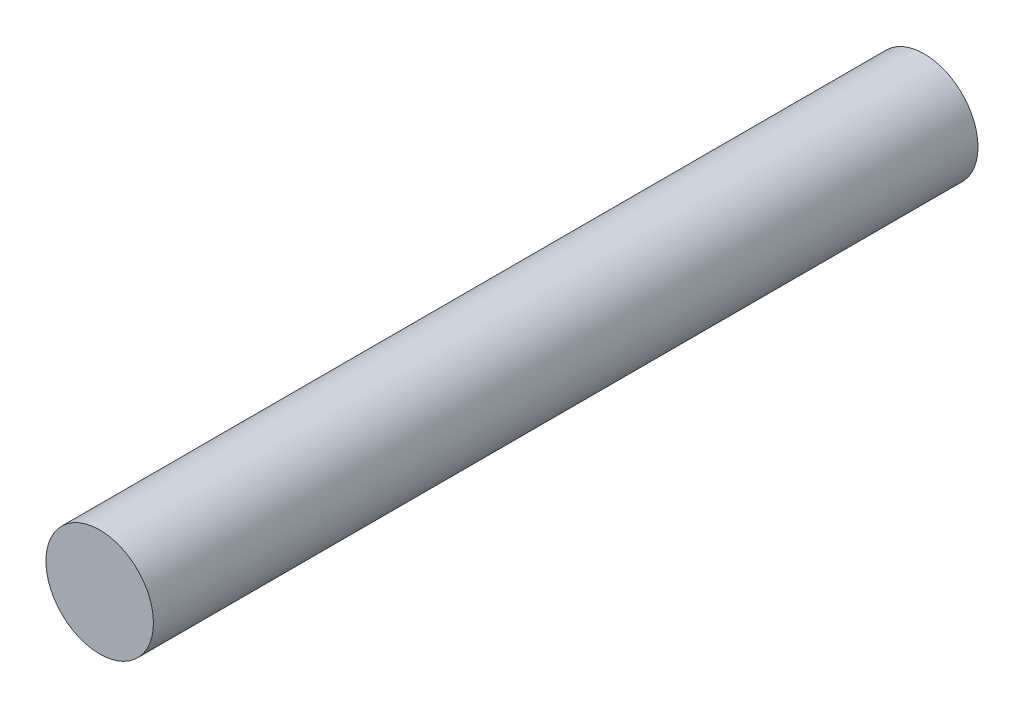
ISO-10303-21;
HEADER;
FILE_DESCRIPTION(('STEP AP214'),'2;1');
FILE_NAME('part.step','',(''),(''),'','','');
FILE_SCHEMA(('AUTOMOTIVE_DESIGN { 1 0 10303 214 1 1 1 1 }'));
ENDSEC;
DATA;
#1=APPLICATION_CONTEXT('core data for automotive mechanical design processes');
#2=APPLICATION_PROTOCOL_DEFINITION('international standard','automotive_design',2000,#1);
#3=PRODUCT_CONTEXT('',#1,'mechanical');
#4=PRODUCT('Part','Part','',(#3));
#5=PRODUCT_RELATED_PRODUCT_CATEGORY('part','',(#4));
#6=PRODUCT_DEFINITION_FORMATION('','',#4);
#7=PRODUCT_DEFINITION_CONTEXT('part definition',#1,'design');
#8=PRODUCT_DEFINITION('design','',#6,#7);
#9=PRODUCT_DEFINITION_SHAPE('','',#8);
#10=(LENGTH_UNIT() NAMED_UNIT(*) SI_UNIT(.MILLI.,.METRE.));
#11=(NAMED_UNIT(*) PLANE_ANGLE_UNIT() SI_UNIT($,.RADIAN.));
#12=(NAMED_UNIT(*) SI_UNIT($,.STERADIAN.) SOLID_ANGLE_UNIT());
#13=UNCERTAINTY_MEASURE_WITH_UNIT(LENGTH_MEASURE(1.E-05),#10,'distance_accuracy_value','');
#14=(GEOMETRIC_REPRESENTATION_CONTEXT(3) GLOBAL_UNCERTAINTY_ASSIGNED_CONTEXT((#13)) GLOBAL_UNIT_ASSIGNED_CONTEXT((#10,
#11,#12)) REPRESENTATION_CONTEXT('',''));
#15=CARTESIAN_POINT('',(0.,0.,0.));
#16=DIRECTION('',(0.,0.,1.));
#17=DIRECTION('',(1.,0.,0.));
#18=AXIS2_PLACEMENT_3D('',#15,#16,#17);
#19=CARTESIAN_POINT('',(0.,0.,230.));
#20=DIRECTION('',(0.,0.,-1.));
#21=DIRECTION('',(-1.,0.,0.));
#22=AXIS2_PLACEMENT_3D('',#19,#20,#21);
#23=CYLINDRICAL_SURFACE('',#22,15.);
#24=CARTESIAN_POINT('',(0.,0.,230.));
#25=DIRECTION('',(0.,0.,1.));
#26=DIRECTION('',(1.,0.,0.));
#27=AXIS2_PLACEMENT_3D('',#24,#25,#26);
#28=CIRCLE('',#27,15.);
#29=CARTESIAN_POINT('',(15.,0.,230.));
#30=VERTEX_POINT('',#29);
#31=EDGE_CURVE('E10',#30,#30,#28,.T.);
#32=ORIENTED_EDGE('',*,*,#31,.F.);
#33=EDGE_LOOP('',(#32));
#34=FACE_BOUND('',#33,.T.);
#35=CARTESIAN_POINT('',(0.,0.,0.));
#36=DIRECTION('',(0.,0.,1.));
#37=DIRECTION('',(1.,0.,0.));
#38=AXIS2_PLACEMENT_3D('',#35,#36,#37);
#39=CIRCLE('',#38,15.);
#40=CARTESIAN_POINT('',(15.,0.,0.));
#41=VERTEX_POINT('',#40);
#42=EDGE_CURVE('E38',#41,#41,#39,.T.);
#43=ORIENTED_EDGE('',*,*,#42,.T.);
#44=EDGE_LOOP('',(#43));
#45=FACE_BOUND('',#44,.T.);
#46=ADVANCED_FACE('F35',(#34,#45),#23,.T.);
#47=CARTESIAN_POINT('',(0.,0.,230.));
#48=DIRECTION('',(0.,0.,1.));
#49=DIRECTION('',(1.,0.,0.));
#50=AXIS2_PLACEMENT_3D('',#47,#48,#49);
#51=PLANE('',#50);
#52=ORIENTED_EDGE('',*,*,#31,.T.);
#53=EDGE_LOOP('',(#52));
#54=FACE_BOUND('',#53,.T.);
#55=ADVANCED_FACE('F50',(#54),#51,.T.);
#56=CARTESIAN_POINT('',(0.,0.,0.));
#57=DIRECTION('',(0.,0.,1.));
#58=DIRECTION('',(1.,0.,0.));
#59=AXIS2_PLACEMENT_3D('',#56,#57,#58);
#60=PLANE('',#59);
#61=ORIENTED_EDGE('',*,*,#42,.F.);
#62=EDGE_LOOP('',(#61));
#63=FACE_BOUND('',#62,.T.);
#64=ADVANCED_FACE('F48',(#63),#60,.F.);
#65=CLOSED_SHELL('',(#46,#55,#64));
#66=MANIFOLD_SOLID_BREP('B2',#65);
#67=ADVANCED_BREP_SHAPE_REPRESENTATION('',(#18,#66),#14);
#68=SHAPE_DEFINITION_REPRESENTATION(#9,#67);
ENDSEC;
END-ISO-10303-21;
